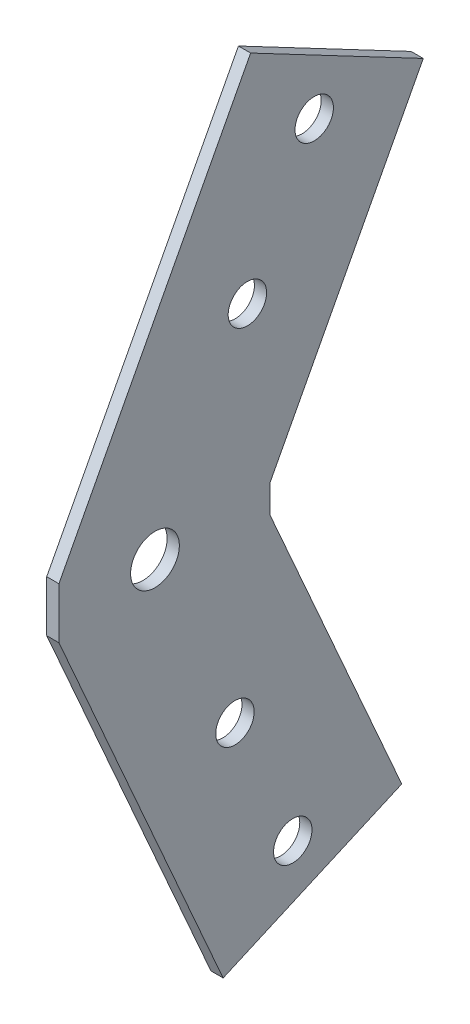
ISO-10303-21;
HEADER;
FILE_DESCRIPTION(('STEP AP214'),'2;1');
FILE_NAME('part.step','',(''),(''),'','','');
FILE_SCHEMA(('AUTOMOTIVE_DESIGN { 1 0 10303 214 1 1 1 1 }'));
ENDSEC;
DATA;
#1=APPLICATION_CONTEXT('core data for automotive mechanical design processes');
#2=APPLICATION_PROTOCOL_DEFINITION('international standard','automotive_design',2000,#1);
#3=PRODUCT_CONTEXT('',#1,'mechanical');
#4=PRODUCT('Part','Part','',(#3));
#5=PRODUCT_RELATED_PRODUCT_CATEGORY('part','',(#4));
#6=PRODUCT_DEFINITION_FORMATION('','',#4);
#7=PRODUCT_DEFINITION_CONTEXT('part definition',#1,'design');
#8=PRODUCT_DEFINITION('design','',#6,#7);
#9=PRODUCT_DEFINITION_SHAPE('','',#8);
#10=(LENGTH_UNIT() NAMED_UNIT(*) SI_UNIT(.MILLI.,.METRE.));
#11=(NAMED_UNIT(*) PLANE_ANGLE_UNIT() SI_UNIT($,.RADIAN.));
#12=(NAMED_UNIT(*) SI_UNIT($,.STERADIAN.) SOLID_ANGLE_UNIT());
#13=UNCERTAINTY_MEASURE_WITH_UNIT(LENGTH_MEASURE(1.E-05),#10,'distance_accuracy_value','');
#14=(GEOMETRIC_REPRESENTATION_CONTEXT(3) GLOBAL_UNCERTAINTY_ASSIGNED_CONTEXT((#13)) GLOBAL_UNIT_ASSIGNED_CONTEXT((#10,
#11,#12)) REPRESENTATION_CONTEXT('',''));
#15=CARTESIAN_POINT('',(0.,0.,0.));
#16=DIRECTION('',(0.,0.,1.));
#17=DIRECTION('',(1.,0.,0.));
#18=AXIS2_PLACEMENT_3D('',#15,#16,#17);
#19=CARTESIAN_POINT('',(-3.175,0.,25.));
#20=DIRECTION('',(0.,0.,-1.));
#21=DIRECTION('',(0.,1.,0.));
#22=AXIS2_PLACEMENT_3D('',#19,#20,#21);
#23=PLANE('',#22);
#24=DIRECTION('',(0.,1.,0.));
#25=VECTOR('',#24,1.);
#26=CARTESIAN_POINT('',(0.,0.,25.));
#27=LINE('',#26,#25);
#28=CARTESIAN_POINT('',(0.,-6.25856679293095,25.));
#29=VERTEX_POINT('',#28);
#30=CARTESIAN_POINT('',(0.,7.04288026438832,25.));
#31=VERTEX_POINT('',#30);
#32=EDGE_CURVE('E170',#29,#31,#27,.T.);
#33=ORIENTED_EDGE('',*,*,#32,.T.);
#34=DIRECTION('',(1.,0.,0.));
#35=VECTOR('',#34,1.);
#36=CARTESIAN_POINT('',(-3.175,7.04288026438832,25.));
#37=LINE('',#36,#35);
#38=CARTESIAN_POINT('',(-3.175,7.04288026438832,25.));
#39=VERTEX_POINT('',#38);
#40=EDGE_CURVE('E11',#39,#31,#37,.T.);
#41=ORIENTED_EDGE('',*,*,#40,.F.);
#42=DIRECTION('',(0.,1.,0.));
#43=VECTOR('',#42,1.);
#44=CARTESIAN_POINT('',(-3.175,0.,25.));
#45=LINE('',#44,#43);
#46=CARTESIAN_POINT('',(-3.175,-6.25856679293095,25.));
#47=VERTEX_POINT('',#46);
#48=EDGE_CURVE('E67',#47,#39,#45,.T.);
#49=ORIENTED_EDGE('',*,*,#48,.F.);
#50=DIRECTION('',(1.,0.,0.));
#51=VECTOR('',#50,1.);
#52=CARTESIAN_POINT('',(-3.175,-6.25856679293095,25.));
#53=LINE('',#52,#51);
#54=EDGE_CURVE('E51',#47,#29,#53,.T.);
#55=ORIENTED_EDGE('',*,*,#54,.T.);
#56=EDGE_LOOP('',(#33,#41,#49,#55));
#57=FACE_BOUND('',#56,.T.);
#58=ADVANCED_FACE('F47',(#57),#23,.F.);
#59=CARTESIAN_POINT('',(-3.175,11.843031703268,22.4700378298611));
#60=DIRECTION('',(0.,0.466261090679841,0.88464715865595));
#61=DIRECTION('',(0.,-0.88464715865595,0.466261090679841));
#62=AXIS2_PLACEMENT_3D('',#59,#60,#61);
#63=PLANE('',#62);
#64=DIRECTION('',(0.,-0.88464715865595,0.466261090679841));
#65=VECTOR('',#64,1.);
#66=CARTESIAN_POINT('',(0.,11.843031703268,22.4700378298611));
#67=LINE('',#66,#65);
#68=CARTESIAN_POINT('',(0.,101.723183022712,-24.9020889832108));
#69=VERTEX_POINT('',#68);
#70=EDGE_CURVE('E192',#69,#31,#67,.T.);
#71=ORIENTED_EDGE('',*,*,#70,.F.);
#72=DIRECTION('',(1.,0.,0.));
#73=VECTOR('',#72,1.);
#74=CARTESIAN_POINT('',(-3.175,101.723183022712,-24.9020889832108));
#75=LINE('',#74,#73);
#76=CARTESIAN_POINT('',(-3.175,101.723183022712,-24.9020889832108));
#77=VERTEX_POINT('',#76);
#78=EDGE_CURVE('E58',#77,#69,#75,.T.);
#79=ORIENTED_EDGE('',*,*,#78,.F.);
#80=DIRECTION('',(0.,-0.88464715865595,0.466261090679841));
#81=VECTOR('',#80,1.);
#82=CARTESIAN_POINT('',(-3.175,11.843031703268,22.4700378298611));
#83=LINE('',#82,#81);
#84=EDGE_CURVE('E125',#77,#39,#83,.T.);
#85=ORIENTED_EDGE('',*,*,#84,.T.);
#86=ORIENTED_EDGE('',*,*,#40,.T.);
#87=EDGE_LOOP('',(#71,#79,#85,#86));
#88=FACE_BOUND('',#87,.T.);
#89=ADVANCED_FACE('F219',(#88),#63,.T.);
#90=CARTESIAN_POINT('',(-3.175,89.8801513194445,-47.3721268130719));
#91=DIRECTION('',(0.,-0.88464715865595,0.466261090679841));
#92=DIRECTION('',(0.,-0.466261090679841,-0.88464715865595));
#93=AXIS2_PLACEMENT_3D('',#90,#91,#92);
#94=PLANE('',#93);
#95=DIRECTION('',(0.,-0.466261090679841,-0.88464715865595));
#96=VECTOR('',#95,1.);
#97=CARTESIAN_POINT('',(0.,89.8801513194445,-47.3721268130719));
#98=LINE('',#97,#96);
#99=CARTESIAN_POINT('',(0.,78.0371196161765,-69.842164642933));
#100=VERTEX_POINT('',#99);
#101=EDGE_CURVE('E131',#69,#100,#98,.T.);
#102=ORIENTED_EDGE('',*,*,#101,.T.);
#103=DIRECTION('',(1.,0.,0.));
#104=VECTOR('',#103,1.);
#105=CARTESIAN_POINT('',(-3.175,78.0371196161765,-69.842164642933));
#106=LINE('',#105,#104);
#107=CARTESIAN_POINT('',(-3.175,78.0371196161765,-69.842164642933));
#108=VERTEX_POINT('',#107);
#109=EDGE_CURVE('E129',#108,#100,#106,.T.);
#110=ORIENTED_EDGE('',*,*,#109,.F.);
#111=DIRECTION('',(0.,-0.466261090679841,-0.88464715865595));
#112=VECTOR('',#111,1.);
#113=CARTESIAN_POINT('',(-3.175,89.8801513194445,-47.3721268130719));
#114=LINE('',#113,#112);
#115=EDGE_CURVE('E118',#77,#108,#114,.T.);
#116=ORIENTED_EDGE('',*,*,#115,.F.);
#117=ORIENTED_EDGE('',*,*,#78,.T.);
#118=EDGE_LOOP('',(#102,#110,#116,#117));
#119=FACE_BOUND('',#118,.T.);
#120=ADVANCED_FACE('F130',(#119),#94,.F.);
#121=CARTESIAN_POINT('',(-3.175,-11.843031703268,-22.4700378298611));
#122=DIRECTION('',(0.,0.466261090679842,0.884647158655949));
#123=DIRECTION('',(0.,-0.88464715865595,0.466261090679842));
#124=AXIS2_PLACEMENT_3D('',#121,#122,#123);
#125=PLANE('',#124);
#126=DIRECTION('',(0.,-0.884647158655949,0.466261090679842));
#127=VECTOR('',#126,1.);
#128=CARTESIAN_POINT('',(0.,-11.843031703268,-22.4700378298611));
#129=LINE('',#128,#127);
#130=CARTESIAN_POINT('',(0.,2.44372687846875,-30.));
#131=VERTEX_POINT('',#130);
#132=EDGE_CURVE('E187',#100,#131,#129,.T.);
#133=ORIENTED_EDGE('',*,*,#132,.T.);
#134=DIRECTION('',(1.,0.,0.));
#135=VECTOR('',#134,1.);
#136=CARTESIAN_POINT('',(-3.175,2.44372687846875,-30.));
#137=LINE('',#136,#135);
#138=CARTESIAN_POINT('',(-3.175,2.44372687846875,-30.));
#139=VERTEX_POINT('',#138);
#140=EDGE_CURVE('E136',#139,#131,#137,.T.);
#141=ORIENTED_EDGE('',*,*,#140,.F.);
#142=DIRECTION('',(0.,-0.884647158655949,0.466261090679842));
#143=VECTOR('',#142,1.);
#144=CARTESIAN_POINT('',(-3.175,-11.843031703268,-22.4700378298611));
#145=LINE('',#144,#143);
#146=EDGE_CURVE('E123',#108,#139,#145,.T.);
#147=ORIENTED_EDGE('',*,*,#146,.F.);
#148=ORIENTED_EDGE('',*,*,#109,.T.);
#149=EDGE_LOOP('',(#133,#141,#147,#148));
#150=FACE_BOUND('',#149,.T.);
#151=ADVANCED_FACE('F138',(#150),#125,.F.);
#152=CARTESIAN_POINT('',(-3.175,0.,-30.));
#153=DIRECTION('',(0.,0.,-1.));
#154=DIRECTION('',(0.,1.,0.));
#155=AXIS2_PLACEMENT_3D('',#152,#153,#154);
#156=PLANE('',#155);
#157=DIRECTION('',(0.,1.,0.));
#158=VECTOR('',#157,1.);
#159=CARTESIAN_POINT('',(0.,0.,-30.));
#160=LINE('',#159,#158);
#161=CARTESIAN_POINT('',(0.,-5.08071892135487,-30.));
#162=VERTEX_POINT('',#161);
#163=EDGE_CURVE('E183',#162,#131,#160,.T.);
#164=ORIENTED_EDGE('',*,*,#163,.F.);
#165=DIRECTION('',(1.,0.,0.));
#166=VECTOR('',#165,1.);
#167=CARTESIAN_POINT('',(-3.175,-5.08071892135487,-30.));
#168=LINE('',#167,#166);
#169=CARTESIAN_POINT('',(-3.175,-5.08071892135487,-30.));
#170=VERTEX_POINT('',#169);
#171=EDGE_CURVE('E201',#170,#162,#168,.T.);
#172=ORIENTED_EDGE('',*,*,#171,.F.);
#173=DIRECTION('',(0.,1.,0.));
#174=VECTOR('',#173,1.);
#175=CARTESIAN_POINT('',(-3.175,0.,-30.));
#176=LINE('',#175,#174);
#177=EDGE_CURVE('E141',#170,#139,#176,.T.);
#178=ORIENTED_EDGE('',*,*,#177,.T.);
#179=ORIENTED_EDGE('',*,*,#140,.T.);
#180=EDGE_LOOP('',(#164,#172,#178,#179));
#181=FACE_BOUND('',#180,.T.);
#182=ADVANCED_FACE('F233',(#181),#156,.T.);
#183=CARTESIAN_POINT('',(-3.175,10.2479556430123,-23.2408994046885));
#184=DIRECTION('',(0.,0.403462820591035,-0.914996039554667));
#185=DIRECTION('',(0.,0.914996039554668,0.403462820591035));
#186=AXIS2_PLACEMENT_3D('',#183,#184,#185);
#187=PLANE('',#186);
#188=DIRECTION('',(0.,0.914996039554667,0.403462820591035));
#189=VECTOR('',#188,1.);
#190=CARTESIAN_POINT('',(0.,10.2479556430123,-23.2408994046885));
#191=LINE('',#190,#189);
#192=CARTESIAN_POINT('',(0.,-82.7156419757419,-64.2327219767377));
#193=VERTEX_POINT('',#192);
#194=EDGE_CURVE('E179',#193,#162,#191,.T.);
#195=ORIENTED_EDGE('',*,*,#194,.F.);
#196=DIRECTION('',(1.,0.,0.));
#197=VECTOR('',#196,1.);
#198=CARTESIAN_POINT('',(-3.175,-82.7156419757419,-64.2327219767377));
#199=LINE('',#198,#197);
#200=CARTESIAN_POINT('',(-3.175,-82.7156419757419,-64.2327219767377));
#201=VERTEX_POINT('',#200);
#202=EDGE_CURVE('E204',#201,#193,#199,.T.);
#203=ORIENTED_EDGE('',*,*,#202,.F.);
#204=DIRECTION('',(0.,0.914996039554667,0.403462820591035));
#205=VECTOR('',#204,1.);
#206=CARTESIAN_POINT('',(-3.175,10.2479556430123,-23.2408994046885));
#207=LINE('',#206,#205);
#208=EDGE_CURVE('E144',#201,#170,#207,.T.);
#209=ORIENTED_EDGE('',*,*,#208,.T.);
#210=ORIENTED_EDGE('',*,*,#171,.T.);
#211=EDGE_LOOP('',(#195,#203,#209,#210));
#212=FACE_BOUND('',#211,.T.);
#213=ADVANCED_FACE('F236',(#212),#187,.T.);
#214=CARTESIAN_POINT('',(-3.175,-92.9635976187542,-40.9918225720491));
#215=DIRECTION('',(0.,0.914996039554668,0.403462820591034));
#216=DIRECTION('',(0.,-0.403462820591034,0.914996039554668));
#217=AXIS2_PLACEMENT_3D('',#214,#215,#216);
#218=PLANE('',#217);
#219=DIRECTION('',(0.,-0.403462820591034,0.914996039554668));
#220=VECTOR('',#219,1.);
#221=CARTESIAN_POINT('',(0.,-92.9635976187542,-40.9918225720491));
#222=LINE('',#221,#220);
#223=CARTESIAN_POINT('',(0.,-103.211553261767,-17.7509231673605));
#224=VERTEX_POINT('',#223);
#225=EDGE_CURVE('E176',#193,#224,#222,.T.);
#226=ORIENTED_EDGE('',*,*,#225,.T.);
#227=DIRECTION('',(1.,0.,0.));
#228=VECTOR('',#227,1.);
#229=CARTESIAN_POINT('',(-3.175,-103.211553261767,-17.7509231673605));
#230=LINE('',#229,#228);
#231=CARTESIAN_POINT('',(-3.175,-103.211553261767,-17.7509231673605));
#232=VERTEX_POINT('',#231);
#233=EDGE_CURVE('E206',#232,#224,#230,.T.);
#234=ORIENTED_EDGE('',*,*,#233,.F.);
#235=DIRECTION('',(0.,-0.403462820591034,0.914996039554668));
#236=VECTOR('',#235,1.);
#237=CARTESIAN_POINT('',(-3.175,-92.9635976187542,-40.9918225720491));
#238=LINE('',#237,#236);
#239=EDGE_CURVE('E316',#201,#232,#238,.T.);
#240=ORIENTED_EDGE('',*,*,#239,.F.);
#241=ORIENTED_EDGE('',*,*,#202,.T.);
#242=EDGE_LOOP('',(#226,#234,#240,#241));
#243=FACE_BOUND('',#242,.T.);
#244=ADVANCED_FACE('F240',(#243),#218,.F.);
#245=CARTESIAN_POINT('',(-3.175,0.,0.));
#246=DIRECTION('',(1.,0.,0.));
#247=DIRECTION('',(0.,0.,-1.));
#248=AXIS2_PLACEMENT_3D('',#245,#246,#247);
#249=CYLINDRICAL_SURFACE('',#248,6.35);
#250=CARTESIAN_POINT('',(-3.175,0.,0.));
#251=DIRECTION('',(1.,0.,0.));
#252=DIRECTION('',(0.,0.,-1.));
#253=AXIS2_PLACEMENT_3D('',#250,#251,#252);
#254=CIRCLE('',#253,6.35);
#255=CARTESIAN_POINT('',(-3.175,0.,-6.35));
#256=VERTEX_POINT('',#255);
#257=EDGE_CURVE('E305',#256,#256,#254,.T.);
#258=ORIENTED_EDGE('',*,*,#257,.F.);
#259=EDGE_LOOP('',(#258));
#260=FACE_BOUND('',#259,.T.);
#261=CARTESIAN_POINT('',(0.,0.,0.));
#262=DIRECTION('',(1.,0.,0.));
#263=DIRECTION('',(0.,0.,-1.));
#264=AXIS2_PLACEMENT_3D('',#261,#262,#263);
#265=CIRCLE('',#264,6.35);
#266=CARTESIAN_POINT('',(0.,0.,-6.35));
#267=VERTEX_POINT('',#266);
#268=EDGE_CURVE('E166',#267,#267,#265,.T.);
#269=ORIENTED_EDGE('',*,*,#268,.T.);
#270=EDGE_LOOP('',(#269));
#271=FACE_BOUND('',#270,.T.);
#272=ADVANCED_FACE('F244',(#260,#271),#249,.F.);
#273=CARTESIAN_POINT('',(-3.175,-81.3431479164099,-35.867844750543));
#274=DIRECTION('',(1.,0.,0.));
#275=DIRECTION('',(0.,0.,-1.));
#276=AXIS2_PLACEMENT_3D('',#273,#274,#275);
#277=CYLINDRICAL_SURFACE('',#276,5.00000000000001);
#278=CARTESIAN_POINT('',(-3.175,-81.3431479164099,-35.867844750543));
#279=DIRECTION('',(1.,0.,0.));
#280=DIRECTION('',(0.,0.,-1.));
#281=AXIS2_PLACEMENT_3D('',#278,#279,#280);
#282=CIRCLE('',#281,5.00000000000001);
#283=CARTESIAN_POINT('',(-3.175,-81.3431479164099,-40.867844750543));
#284=VERTEX_POINT('',#283);
#285=EDGE_CURVE('E302',#284,#284,#282,.T.);
#286=ORIENTED_EDGE('',*,*,#285,.F.);
#287=EDGE_LOOP('',(#286));
#288=FACE_BOUND('',#287,.T.);
#289=CARTESIAN_POINT('',(0.,-81.3431479164099,-35.867844750543));
#290=DIRECTION('',(1.,0.,0.));
#291=DIRECTION('',(0.,0.,-1.));
#292=AXIS2_PLACEMENT_3D('',#289,#290,#291);
#293=CIRCLE('',#292,5.00000000000001);
#294=CARTESIAN_POINT('',(0.,-81.3431479164099,-40.867844750543));
#295=VERTEX_POINT('',#294);
#296=EDGE_CURVE('E162',#295,#295,#293,.T.);
#297=ORIENTED_EDGE('',*,*,#296,.T.);
#298=EDGE_LOOP('',(#297));
#299=FACE_BOUND('',#298,.T.);
#300=ADVANCED_FACE('F251',(#288,#299),#277,.F.);
#301=CARTESIAN_POINT('',(-3.175,-47.2137956410208,-20.8186815424974));
#302=DIRECTION('',(1.,0.,0.));
#303=DIRECTION('',(0.,0.,-1.));
#304=AXIS2_PLACEMENT_3D('',#301,#302,#303);
#305=CYLINDRICAL_SURFACE('',#304,5.);
#306=CARTESIAN_POINT('',(-3.175,-47.2137956410208,-20.8186815424974));
#307=DIRECTION('',(1.,0.,0.));
#308=DIRECTION('',(0.,0.,-1.));
#309=AXIS2_PLACEMENT_3D('',#306,#307,#308);
#310=CIRCLE('',#309,5.);
#311=CARTESIAN_POINT('',(-3.175,-47.2137956410208,-25.8186815424974));
#312=VERTEX_POINT('',#311);
#313=EDGE_CURVE('E298',#312,#312,#310,.T.);
#314=ORIENTED_EDGE('',*,*,#313,.F.);
#315=EDGE_LOOP('',(#314));
#316=FACE_BOUND('',#315,.T.);
#317=CARTESIAN_POINT('',(0.,-47.2137956410208,-20.8186815424974));
#318=DIRECTION('',(1.,0.,0.));
#319=DIRECTION('',(0.,0.,-1.));
#320=AXIS2_PLACEMENT_3D('',#317,#318,#319);
#321=CIRCLE('',#320,5.);
#322=CARTESIAN_POINT('',(0.,-47.2137956410208,-25.8186815424974));
#323=VERTEX_POINT('',#322);
#324=EDGE_CURVE('E158',#323,#323,#321,.T.);
#325=ORIENTED_EDGE('',*,*,#324,.T.);
#326=EDGE_LOOP('',(#325));
#327=FACE_BOUND('',#326,.T.);
#328=ADVANCED_FACE('F255',(#316,#327),#305,.F.);
#329=CARTESIAN_POINT('',(-3.175,78.6451324045139,-41.4506109614379));
#330=DIRECTION('',(1.,0.,0.));
#331=DIRECTION('',(0.,0.,-1.));
#332=AXIS2_PLACEMENT_3D('',#329,#330,#331);
#333=CYLINDRICAL_SURFACE('',#332,5.00000000000001);
#334=CARTESIAN_POINT('',(-3.175,78.6451324045139,-41.4506109614379));
#335=DIRECTION('',(1.,0.,0.));
#336=DIRECTION('',(0.,0.,-1.));
#337=AXIS2_PLACEMENT_3D('',#334,#335,#336);
#338=CIRCLE('',#337,5.00000000000001);
#339=CARTESIAN_POINT('',(-3.175,78.6451324045139,-46.4506109614379));
#340=VERTEX_POINT('',#339);
#341=EDGE_CURVE('E269',#340,#340,#338,.T.);
#342=ORIENTED_EDGE('',*,*,#341,.F.);
#343=EDGE_LOOP('',(#342));
#344=FACE_BOUND('',#343,.T.);
#345=CARTESIAN_POINT('',(0.,78.6451324045139,-41.4506109614379));
#346=DIRECTION('',(1.,0.,0.));
#347=DIRECTION('',(0.,0.,-1.));
#348=AXIS2_PLACEMENT_3D('',#345,#346,#347);
#349=CIRCLE('',#348,5.00000000000001);
#350=CARTESIAN_POINT('',(0.,78.6451324045139,-46.4506109614379));
#351=VERTEX_POINT('',#350);
#352=EDGE_CURVE('E154',#351,#351,#349,.T.);
#353=ORIENTED_EDGE('',*,*,#352,.T.);
#354=EDGE_LOOP('',(#353));
#355=FACE_BOUND('',#354,.T.);
#356=ADVANCED_FACE('F258',(#344,#355),#333,.F.);
#357=CARTESIAN_POINT('',(-3.175,45.647793386647,-24.0590722790798));
#358=DIRECTION('',(1.,0.,0.));
#359=DIRECTION('',(0.,0.,-1.));
#360=AXIS2_PLACEMENT_3D('',#357,#358,#359);
#361=CYLINDRICAL_SURFACE('',#360,5.);
#362=CARTESIAN_POINT('',(-3.175,45.647793386647,-24.0590722790798));
#363=DIRECTION('',(1.,0.,0.));
#364=DIRECTION('',(0.,0.,-1.));
#365=AXIS2_PLACEMENT_3D('',#362,#363,#364);
#366=CIRCLE('',#365,5.);
#367=CARTESIAN_POINT('',(-3.175,45.647793386647,-29.0590722790798));
#368=VERTEX_POINT('',#367);
#369=EDGE_CURVE('E195',#368,#368,#366,.T.);
#370=ORIENTED_EDGE('',*,*,#369,.F.);
#371=EDGE_LOOP('',(#370));
#372=FACE_BOUND('',#371,.T.);
#373=CARTESIAN_POINT('',(0.,45.647793386647,-24.0590722790798));
#374=DIRECTION('',(1.,0.,0.));
#375=DIRECTION('',(0.,0.,-1.));
#376=AXIS2_PLACEMENT_3D('',#373,#374,#375);
#377=CIRCLE('',#376,5.);
#378=CARTESIAN_POINT('',(0.,45.647793386647,-29.0590722790798));
#379=VERTEX_POINT('',#378);
#380=EDGE_CURVE('E150',#379,#379,#377,.T.);
#381=ORIENTED_EDGE('',*,*,#380,.T.);
#382=EDGE_LOOP('',(#381));
#383=FACE_BOUND('',#382,.T.);
#384=ADVANCED_FACE('F49',(#372,#383),#361,.F.);
#385=CARTESIAN_POINT('',(-3.175,-10.2479556430123,23.2408994046885));
#386=DIRECTION('',(0.,0.403462820591034,-0.914996039554668));
#387=DIRECTION('',(0.,0.914996039554668,0.403462820591034));
#388=AXIS2_PLACEMENT_3D('',#385,#386,#387);
#389=PLANE('',#388);
#390=DIRECTION('',(0.,0.914996039554668,0.403462820591034));
#391=VECTOR('',#390,1.);
#392=CARTESIAN_POINT('',(0.,-10.2479556430123,23.2408994046885));
#393=LINE('',#392,#391);
#394=EDGE_CURVE('E173',#224,#29,#393,.T.);
#395=ORIENTED_EDGE('',*,*,#394,.T.);
#396=ORIENTED_EDGE('',*,*,#54,.F.);
#397=DIRECTION('',(0.,0.914996039554668,0.403462820591034));
#398=VECTOR('',#397,1.);
#399=CARTESIAN_POINT('',(-3.175,-10.2479556430123,23.2408994046885));
#400=LINE('',#399,#398);
#401=EDGE_CURVE('E105',#232,#47,#400,.T.);
#402=ORIENTED_EDGE('',*,*,#401,.F.);
#403=ORIENTED_EDGE('',*,*,#233,.T.);
#404=EDGE_LOOP('',(#395,#396,#402,#403));
#405=FACE_BOUND('',#404,.T.);
#406=ADVANCED_FACE('F246',(#405),#389,.F.);
#407=CARTESIAN_POINT('',(-3.175,0.,0.));
#408=DIRECTION('',(1.,0.,0.));
#409=DIRECTION('',(0.,0.,-1.));
#410=AXIS2_PLACEMENT_3D('',#407,#408,#409);
#411=PLANE('',#410);
#412=ORIENTED_EDGE('',*,*,#369,.T.);
#413=EDGE_LOOP('',(#412));
#414=FACE_BOUND('',#413,.T.);
#415=ORIENTED_EDGE('',*,*,#341,.T.);
#416=EDGE_LOOP('',(#415));
#417=FACE_BOUND('',#416,.T.);
#418=ORIENTED_EDGE('',*,*,#313,.T.);
#419=EDGE_LOOP('',(#418));
#420=FACE_BOUND('',#419,.T.);
#421=ORIENTED_EDGE('',*,*,#285,.T.);
#422=EDGE_LOOP('',(#421));
#423=FACE_BOUND('',#422,.T.);
#424=ORIENTED_EDGE('',*,*,#257,.T.);
#425=EDGE_LOOP('',(#424));
#426=FACE_BOUND('',#425,.T.);
#427=ORIENTED_EDGE('',*,*,#48,.T.);
#428=ORIENTED_EDGE('',*,*,#84,.F.);
#429=ORIENTED_EDGE('',*,*,#115,.T.);
#430=ORIENTED_EDGE('',*,*,#146,.T.);
#431=ORIENTED_EDGE('',*,*,#177,.F.);
#432=ORIENTED_EDGE('',*,*,#208,.F.);
#433=ORIENTED_EDGE('',*,*,#239,.T.);
#434=ORIENTED_EDGE('',*,*,#401,.T.);
#435=EDGE_LOOP('',(#427,#428,#429,#430,#431,#432,#433,#434));
#436=FACE_BOUND('',#435,.T.);
#437=ADVANCED_FACE('F120',(#414,#417,#420,#423,#426,#436),#411,.F.);
#438=CARTESIAN_POINT('',(0.,0.,0.));
#439=DIRECTION('',(1.,0.,0.));
#440=DIRECTION('',(0.,0.,-1.));
#441=AXIS2_PLACEMENT_3D('',#438,#439,#440);
#442=PLANE('',#441);
#443=ORIENTED_EDGE('',*,*,#380,.F.);
#444=EDGE_LOOP('',(#443));
#445=FACE_BOUND('',#444,.T.);
#446=ORIENTED_EDGE('',*,*,#352,.F.);
#447=EDGE_LOOP('',(#446));
#448=FACE_BOUND('',#447,.T.);
#449=ORIENTED_EDGE('',*,*,#324,.F.);
#450=EDGE_LOOP('',(#449));
#451=FACE_BOUND('',#450,.T.);
#452=ORIENTED_EDGE('',*,*,#296,.F.);
#453=EDGE_LOOP('',(#452));
#454=FACE_BOUND('',#453,.T.);
#455=ORIENTED_EDGE('',*,*,#268,.F.);
#456=EDGE_LOOP('',(#455));
#457=FACE_BOUND('',#456,.T.);
#458=ORIENTED_EDGE('',*,*,#32,.F.);
#459=ORIENTED_EDGE('',*,*,#394,.F.);
#460=ORIENTED_EDGE('',*,*,#225,.F.);
#461=ORIENTED_EDGE('',*,*,#194,.T.);
#462=ORIENTED_EDGE('',*,*,#163,.T.);
#463=ORIENTED_EDGE('',*,*,#132,.F.);
#464=ORIENTED_EDGE('',*,*,#101,.F.);
#465=ORIENTED_EDGE('',*,*,#70,.T.);
#466=EDGE_LOOP('',(#458,#459,#460,#461,#462,#463,#464,#465));
#467=FACE_BOUND('',#466,.T.);
#468=ADVANCED_FACE('F217',(#445,#448,#451,#454,#457,#467),#442,.T.);
#469=CLOSED_SHELL('',(#58,#89,#120,#151,#182,#213,#244,#272,#300,#328,#356,#384,#406,#437,#468));
#470=MANIFOLD_SOLID_BREP('B2',#469);
#471=ADVANCED_BREP_SHAPE_REPRESENTATION('',(#18,#470),#14);
#472=SHAPE_DEFINITION_REPRESENTATION(#9,#471);
ENDSEC;
END-ISO-10303-21;
